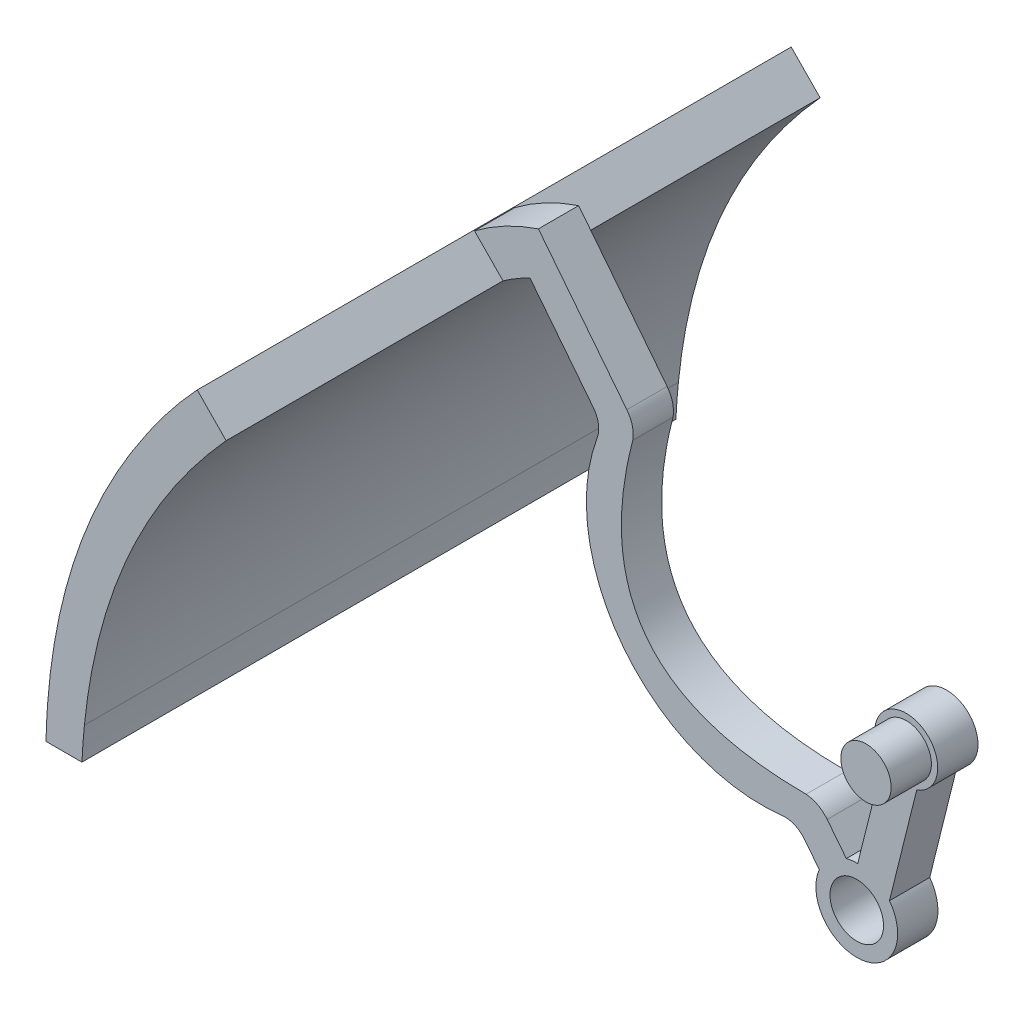
ISO-10303-21;
HEADER;
FILE_DESCRIPTION(('STEP AP214'),'2;1');
FILE_NAME('part.step','',(''),(''),'','','');
FILE_SCHEMA(('AUTOMOTIVE_DESIGN { 1 0 10303 214 1 1 1 1 }'));
ENDSEC;
DATA;
#1=APPLICATION_CONTEXT('core data for automotive mechanical design processes');
#2=APPLICATION_PROTOCOL_DEFINITION('international standard','automotive_design',2000,#1);
#3=PRODUCT_CONTEXT('',#1,'mechanical');
#4=PRODUCT('Part','Part','',(#3));
#5=PRODUCT_RELATED_PRODUCT_CATEGORY('part','',(#4));
#6=PRODUCT_DEFINITION_FORMATION('','',#4);
#7=PRODUCT_DEFINITION_CONTEXT('part definition',#1,'design');
#8=PRODUCT_DEFINITION('design','',#6,#7);
#9=PRODUCT_DEFINITION_SHAPE('','',#8);
#10=(LENGTH_UNIT() NAMED_UNIT(*) SI_UNIT(.MILLI.,.METRE.));
#11=(NAMED_UNIT(*) PLANE_ANGLE_UNIT() SI_UNIT($,.RADIAN.));
#12=(NAMED_UNIT(*) SI_UNIT($,.STERADIAN.) SOLID_ANGLE_UNIT());
#13=UNCERTAINTY_MEASURE_WITH_UNIT(LENGTH_MEASURE(1.E-05),#10,'distance_accuracy_value','');
#14=(GEOMETRIC_REPRESENTATION_CONTEXT(3) GLOBAL_UNCERTAINTY_ASSIGNED_CONTEXT((#13)) GLOBAL_UNIT_ASSIGNED_CONTEXT((#10,
#11,#12)) REPRESENTATION_CONTEXT('',''));
#15=CARTESIAN_POINT('',(0.,0.,0.));
#16=DIRECTION('',(0.,0.,1.));
#17=DIRECTION('',(1.,0.,0.));
#18=AXIS2_PLACEMENT_3D('',#15,#16,#17);
#19=CARTESIAN_POINT('',(19.2460995960396,21.529970793234,40.005));
#20=DIRECTION('',(0.,0.,-1.));
#21=DIRECTION('',(-1.,0.,0.));
#22=AXIS2_PLACEMENT_3D('',#19,#20,#21);
#23=CYLINDRICAL_SURFACE('',#22,23.4429883863396);
#24=DIRECTION('',(0.,0.,-1.));
#25=VECTOR('',#24,1.);
#26=CARTESIAN_POINT('',(9.08704396215267,42.6573770019867,40.005));
#27=LINE('',#26,#25);
#28=CARTESIAN_POINT('',(9.08704396215266,42.6573770019867,40.005));
#29=VERTEX_POINT('',#28);
#30=CARTESIAN_POINT('',(9.08704396215266,42.6573770019867,34.925));
#31=VERTEX_POINT('',#30);
#32=EDGE_CURVE('E286',#29,#31,#27,.T.);
#33=ORIENTED_EDGE('',*,*,#32,.F.);
#34=CARTESIAN_POINT('',(19.2460995960396,21.529970793234,40.005));
#35=DIRECTION('',(0.,0.,-1.));
#36=DIRECTION('',(-1.,0.,0.));
#37=AXIS2_PLACEMENT_3D('',#34,#35,#36);
#38=CIRCLE('',#37,23.4429883863396);
#39=CARTESIAN_POINT('',(5.67762300860634,40.6472443325839,40.005));
#40=VERTEX_POINT('',#39);
#41=EDGE_CURVE('E370',#40,#29,#38,.T.);
#42=ORIENTED_EDGE('',*,*,#41,.F.);
#43=DIRECTION('',(0.,0.,-1.));
#44=VECTOR('',#43,1.);
#45=CARTESIAN_POINT('',(5.67762300860634,40.6472443325839,40.005));
#46=LINE('',#45,#44);
#47=CARTESIAN_POINT('',(5.67762300860634,40.6472443325839,34.925));
#48=VERTEX_POINT('',#47);
#49=EDGE_CURVE('E374',#40,#48,#46,.T.);
#50=ORIENTED_EDGE('',*,*,#49,.T.);
#51=CARTESIAN_POINT('',(19.2460995960396,21.529970793234,34.925));
#52=DIRECTION('',(0.,0.,-1.));
#53=DIRECTION('',(-1.,0.,0.));
#54=AXIS2_PLACEMENT_3D('',#51,#52,#53);
#55=CIRCLE('',#54,23.4429883863396);
#56=EDGE_CURVE('E361',#48,#31,#55,.T.);
#57=ORIENTED_EDGE('',*,*,#56,.T.);
#58=EDGE_LOOP('',(#33,#42,#50,#57));
#59=FACE_BOUND('',#58,.T.);
#60=ADVANCED_FACE('F43',(#59),#23,.F.);
#61=CARTESIAN_POINT('',(2.03170084016378,44.3710469337757,74.93));
#62=DIRECTION('',(0.714539318399716,0.699595284761746,0.));
#63=DIRECTION('',(-0.699595284761746,0.714539318399716,0.));
#64=AXIS2_PLACEMENT_3D('',#61,#62,#63);
#65=PLANE('',#64);
#66=DIRECTION('',(0.,0.,-1.));
#67=VECTOR('',#66,1.);
#68=CARTESIAN_POINT('',(2.08714389423334,44.3144195623115,40.005));
#69=LINE('',#68,#67);
#70=CARTESIAN_POINT('',(2.08714389423334,44.3144195623115,40.005));
#71=VERTEX_POINT('',#70);
#72=CARTESIAN_POINT('',(2.08714389423334,44.3144195623115,34.925));
#73=VERTEX_POINT('',#72);
#74=EDGE_CURVE('E373',#71,#73,#69,.T.);
#75=ORIENTED_EDGE('',*,*,#74,.T.);
#76=DIRECTION('',(0.69959528476175,-0.714539318399712,0.));
#77=VECTOR('',#76,1.);
#78=CARTESIAN_POINT('',(23.2178871640164,22.7323031270756,34.925));
#79=LINE('',#78,#77);
#80=EDGE_CURVE('E355',#73,#48,#79,.T.);
#81=ORIENTED_EDGE('',*,*,#80,.T.);
#82=DIRECTION('',(0.,0.,-1.));
#83=VECTOR('',#82,1.);
#84=CARTESIAN_POINT('',(5.67762300860634,40.6472443325839,74.93));
#85=LINE('',#84,#83);
#86=CARTESIAN_POINT('',(5.67762300860634,40.6472443325839,0.));
#87=VERTEX_POINT('',#86);
#88=EDGE_CURVE('E583',#48,#87,#85,.T.);
#89=ORIENTED_EDGE('',*,*,#88,.T.);
#90=DIRECTION('',(0.699595284761746,-0.714539318399716,0.));
#91=VECTOR('',#90,1.);
#92=CARTESIAN_POINT('',(2.03170084016378,44.3710469337757,0.));
#93=LINE('',#92,#91);
#94=CARTESIAN_POINT('',(2.03170084016378,44.3710469337757,0.));
#95=VERTEX_POINT('',#94);
#96=EDGE_CURVE('E377',#95,#87,#93,.T.);
#97=ORIENTED_EDGE('',*,*,#96,.F.);
#98=DIRECTION('',(0.,0.,-1.));
#99=VECTOR('',#98,1.);
#100=CARTESIAN_POINT('',(2.03170084016378,44.3710469337757,74.93));
#101=LINE('',#100,#99);
#102=CARTESIAN_POINT('',(2.03170084016378,44.3710469337757,74.93));
#103=VERTEX_POINT('',#102);
#104=EDGE_CURVE('E391',#103,#95,#101,.T.);
#105=ORIENTED_EDGE('',*,*,#104,.F.);
#106=DIRECTION('',(0.699595284761746,-0.714539318399716,0.));
#107=VECTOR('',#106,1.);
#108=CARTESIAN_POINT('',(2.03170084016378,44.3710469337757,74.93));
#109=LINE('',#108,#107);
#110=CARTESIAN_POINT('',(5.67762300860634,40.6472443325839,74.93));
#111=VERTEX_POINT('',#110);
#112=EDGE_CURVE('E382',#103,#111,#109,.T.);
#113=ORIENTED_EDGE('',*,*,#112,.T.);
#114=EDGE_CURVE('E577',#111,#40,#85,.T.);
#115=ORIENTED_EDGE('',*,*,#114,.T.);
#116=DIRECTION('',(0.69959528476175,-0.714539318399712,0.));
#117=VECTOR('',#116,1.);
#118=CARTESIAN_POINT('',(23.2178871640164,22.7323031270756,40.005));
#119=LINE('',#118,#117);
#120=EDGE_CURVE('E364',#71,#40,#119,.T.);
#121=ORIENTED_EDGE('',*,*,#120,.F.);
#122=EDGE_LOOP('',(#75,#81,#89,#97,#105,#113,#115,#121));
#123=FACE_BOUND('',#122,.T.);
#124=ADVANCED_FACE('F45',(#123),#65,.T.);
#125=CARTESIAN_POINT('',(2.03170084016369,44.3710469337756,74.93));
#126=CARTESIAN_POINT('',(1.54506194315562,43.8493335032861,74.93));
#127=CARTESIAN_POINT('',(0.584048878796934,42.784657511292,74.93));
#128=CARTESIAN_POINT('',(-1.2278822813047,40.6342721712785,74.93));
#129=CARTESIAN_POINT('',(-4.20592041290579,36.7376412256842,74.93));
#130=CARTESIAN_POINT('',(-7.8686300715973,30.8427287351808,74.93));
#131=CARTESIAN_POINT('',(-11.2850757645936,23.2591606147364,74.93));
#132=CARTESIAN_POINT('',(-12.8911269544739,17.9284224113264,74.93));
#133=CARTESIAN_POINT('',(-13.5163822825003,15.2277853104537,74.93));
#134=B_SPLINE_CURVE_WITH_KNOTS('',3,(#125,#126,#127,#128,#129,#130,#131,#132,#133),
.UNSPECIFIED.,.F.,.F.,(4,1,1,1,1,1,4),(0.192222825960246,0.287167092833515,0.382111359706784,
0.571999893453322,0.951776960946398,1.33155402843947,1.71133109593255),.UNSPECIFIED.);
#135=DIRECTION('',(0.,0.,-1.));
#136=VECTOR('',#135,1.);
#137=SURFACE_OF_LINEAR_EXTRUSION('',#134,#136);
#138=CARTESIAN_POINT('',(2.03170084016369,44.3710469337756,0.));
#139=CARTESIAN_POINT('',(1.54506194315562,43.8493335032861,0.));
#140=CARTESIAN_POINT('',(0.584048878796934,42.784657511292,0.));
#141=CARTESIAN_POINT('',(-1.2278822813047,40.6342721712785,0.));
#142=CARTESIAN_POINT('',(-4.20592041290579,36.7376412256842,0.));
#143=CARTESIAN_POINT('',(-7.8686300715973,30.8427287351808,0.));
#144=CARTESIAN_POINT('',(-11.2850757645936,23.2591606147364,0.));
#145=CARTESIAN_POINT('',(-12.8911269544739,17.9284224113264,0.));
#146=CARTESIAN_POINT('',(-13.5163822825003,15.2277853104537,0.));
#147=B_SPLINE_CURVE_WITH_KNOTS('',3,(#138,#139,#140,#141,#142,#143,#144,#145,#146),
.UNSPECIFIED.,.F.,.F.,(4,1,1,1,1,1,4),(0.192222825960246,0.287167092833515,0.382111359706784,
0.571999893453322,0.951776960946398,1.33155402843947,1.71133109593255),.UNSPECIFIED.);
#148=CARTESIAN_POINT('',(-4.5365302116178,36.0596996946383,0.));
#149=VERTEX_POINT('',#148);
#150=EDGE_CURVE('E386',#95,#149,#147,.T.);
#151=ORIENTED_EDGE('',*,*,#150,.T.);
#152=DIRECTION('',(0.,0.,-1.));
#153=VECTOR('',#152,1.);
#154=CARTESIAN_POINT('',(-4.53653021854659,36.0596996842303,74.93));
#155=LINE('',#154,#153);
#156=CARTESIAN_POINT('',(-4.5365302116178,36.0596996946383,74.93));
#157=VERTEX_POINT('',#156);
#158=EDGE_CURVE('E66',#149,#157,#155,.F.);
#159=ORIENTED_EDGE('',*,*,#158,.T.);
#160=EDGE_CURVE('E385',#103,#157,#134,.T.);
#161=ORIENTED_EDGE('',*,*,#160,.F.);
#162=ORIENTED_EDGE('',*,*,#104,.T.);
#163=EDGE_LOOP('',(#151,#159,#161,#162));
#164=FACE_BOUND('',#163,.T.);
#165=ADVANCED_FACE('F396',(#164),#137,.F.);
#166=CARTESIAN_POINT('',(-11.6238657922747,7.6482492423895,74.93));
#167=DIRECTION('',(0.,0.,-1.));
#168=DIRECTION('',(-1.,0.,0.));
#169=AXIS2_PLACEMENT_3D('',#166,#167,#168);
#170=PLANE('',#169);
#171=CARTESIAN_POINT('',(5.67762300860634,40.6472443325839,74.93));
#172=CARTESIAN_POINT('',(-9.8790320964288,23.5215323798381,74.93));
#173=CARTESIAN_POINT('',(-12.1999935263348,0.628671186533673,74.93));
#174=B_SPLINE_CURVE_WITH_KNOTS('',2,(#171,#172,#173),.UNSPECIFIED.,.F.,.F.,(3,3),(0.,1.),.UNSPECIFIED.);
#175=CARTESIAN_POINT('',(-12.1999935263348,0.628671186533673,74.93));
#176=VERTEX_POINT('',#175);
#177=EDGE_CURVE('E325',#111,#176,#174,.T.);
#178=ORIENTED_EDGE('',*,*,#177,.F.);
#179=ORIENTED_EDGE('',*,*,#112,.F.);
#180=ORIENTED_EDGE('',*,*,#160,.T.);
#181=CARTESIAN_POINT('',(-16.8437433671853,0.628671186533673,74.93));
#182=CARTESIAN_POINT('',(-15.0089406588074,25.4945744171445,74.93));
#183=CARTESIAN_POINT('',(2.03170084016378,44.3710469337757,74.93));
#184=B_SPLINE_CURVE_WITH_KNOTS('',2,(#181,#182,#183),.UNSPECIFIED.,.F.,.F.,(3,3),(0.,1.),.UNSPECIFIED.);
#185=CARTESIAN_POINT('',(-16.8437433671853,0.628671186533673,74.93));
#186=VERTEX_POINT('',#185);
#187=EDGE_CURVE('E318',#186,#157,#184,.T.);
#188=ORIENTED_EDGE('',*,*,#187,.F.);
#189=CARTESIAN_POINT('',(926095.274424654,-377422.025325685,74.93));
#190=CARTESIAN_POINT('',(-930436.062649349,366506.821677623,74.93));
#191=CARTESIAN_POINT('',(934728.617374353,-355503.878612572,74.93));
#192=B_SPLINE_CURVE_WITH_KNOTS('',2,(#189,#190,#191),.UNSPECIFIED.,.F.,.F.,(3,3),(0.,1.),.UNSPECIFIED.);
#193=CARTESIAN_POINT('',(-17.0442105774959,-3.56902205301305,74.93));
#194=VERTEX_POINT('',#193);
#195=EDGE_CURVE('E288',#194,#186,#192,.T.);
#196=ORIENTED_EDGE('',*,*,#195,.F.);
#197=DIRECTION('',(1.,0.,0.));
#198=VECTOR('',#197,1.);
#199=CARTESIAN_POINT('',(0.,-3.56902205301305,74.93));
#200=LINE('',#199,#198);
#201=CARTESIAN_POINT('',(-12.5120122346454,-3.56902205301305,74.93));
#202=VERTEX_POINT('',#201);
#203=EDGE_CURVE('E549',#194,#202,#200,.T.);
#204=ORIENTED_EDGE('',*,*,#203,.T.);
#205=CARTESIAN_POINT('',(921353.978401041,-388858.069858918,74.93));
#206=CARTESIAN_POINT('',(-916760.002458557,399475.643906595,74.93));
#207=CARTESIAN_POINT('',(912138.756462011,-410007.141895332,74.93));
#208=B_SPLINE_CURVE_WITH_KNOTS('',2,(#205,#206,#207),.UNSPECIFIED.,.F.,.F.,(3,3),(0.,1.),.UNSPECIFIED.);
#209=EDGE_CURVE('E296',#176,#202,#208,.T.);
#210=ORIENTED_EDGE('',*,*,#209,.F.);
#211=EDGE_LOOP('',(#178,#179,#180,#188,#196,#204,#210));
#212=FACE_BOUND('',#211,.T.);
#213=ADVANCED_FACE('F399',(#212),#170,.F.);
#214=CARTESIAN_POINT('',(-11.6238657922747,7.6482492423895,0.));
#215=DIRECTION('',(0.,0.,-1.));
#216=DIRECTION('',(-1.,0.,0.));
#217=AXIS2_PLACEMENT_3D('',#214,#215,#216);
#218=PLANE('',#217);
#219=ORIENTED_EDGE('',*,*,#96,.T.);
#220=CARTESIAN_POINT('',(5.67762300860634,40.6472443325839,0.));
#221=CARTESIAN_POINT('',(-9.8790320964288,23.5215323798381,0.));
#222=CARTESIAN_POINT('',(-12.1999935263348,0.628671186533673,0.));
#223=B_SPLINE_CURVE_WITH_KNOTS('',2,(#220,#221,#222),.UNSPECIFIED.,.F.,.F.,(3,3),(0.,1.),.UNSPECIFIED.);
#224=CARTESIAN_POINT('',(-12.1999935263348,0.628671186533673,0.));
#225=VERTEX_POINT('',#224);
#226=EDGE_CURVE('E330',#87,#225,#223,.T.);
#227=ORIENTED_EDGE('',*,*,#226,.T.);
#228=CARTESIAN_POINT('',(921353.978401041,-388858.069858918,0.));
#229=CARTESIAN_POINT('',(-916760.002458557,399475.643906595,0.));
#230=CARTESIAN_POINT('',(912138.756462011,-410007.141895332,0.));
#231=B_SPLINE_CURVE_WITH_KNOTS('',2,(#228,#229,#230),.UNSPECIFIED.,.F.,.F.,(3,3),(0.,1.),.UNSPECIFIED.);
#232=CARTESIAN_POINT('',(-12.5120122346454,-3.56902205301305,0.));
#233=VERTEX_POINT('',#232);
#234=EDGE_CURVE('E536',#225,#233,#231,.T.);
#235=ORIENTED_EDGE('',*,*,#234,.T.);
#236=DIRECTION('',(1.,0.,0.));
#237=VECTOR('',#236,1.);
#238=CARTESIAN_POINT('',(0.,-3.56902205301305,0.));
#239=LINE('',#238,#237);
#240=CARTESIAN_POINT('',(-17.0442105774959,-3.56902205301305,0.));
#241=VERTEX_POINT('',#240);
#242=EDGE_CURVE('E295',#241,#233,#239,.T.);
#243=ORIENTED_EDGE('',*,*,#242,.F.);
#244=CARTESIAN_POINT('',(926095.274424654,-377422.025325685,0.));
#245=CARTESIAN_POINT('',(-930436.062649349,366506.821677623,0.));
#246=CARTESIAN_POINT('',(934728.617374353,-355503.878612572,0.));
#247=B_SPLINE_CURVE_WITH_KNOTS('',2,(#244,#245,#246),.UNSPECIFIED.,.F.,.F.,(3,3),(0.,1.),.UNSPECIFIED.);
#248=CARTESIAN_POINT('',(-16.8437433671853,0.628671186533673,0.));
#249=VERTEX_POINT('',#248);
#250=EDGE_CURVE('E289',#241,#249,#247,.T.);
#251=ORIENTED_EDGE('',*,*,#250,.T.);
#252=CARTESIAN_POINT('',(-16.8437433671853,0.628671186533673,0.));
#253=CARTESIAN_POINT('',(-15.0089406588074,25.4945744171445,0.));
#254=CARTESIAN_POINT('',(2.03170084016378,44.3710469337757,0.));
#255=B_SPLINE_CURVE_WITH_KNOTS('',2,(#252,#253,#254),.UNSPECIFIED.,.F.,.F.,(3,3),(0.,1.),.UNSPECIFIED.);
#256=EDGE_CURVE('E338',#249,#149,#255,.T.);
#257=ORIENTED_EDGE('',*,*,#256,.T.);
#258=ORIENTED_EDGE('',*,*,#150,.F.);
#259=EDGE_LOOP('',(#219,#227,#235,#243,#251,#257,#258));
#260=FACE_BOUND('',#259,.T.);
#261=ADVANCED_FACE('F400',(#260),#218,.T.);
#262=CARTESIAN_POINT('',(19.2460995960396,21.529970793234,40.005));
#263=DIRECTION('',(0.,0.,-1.));
#264=DIRECTION('',(-1.,0.,0.));
#265=AXIS2_PLACEMENT_3D('',#262,#263,#264);
#266=CYLINDRICAL_SURFACE('',#265,28.5229883863397);
#267=DIRECTION('',(0.,0.,-1.));
#268=VECTOR('',#267,1.);
#269=CARTESIAN_POINT('',(10.14487048346,48.5619610108928,40.005));
#270=LINE('',#269,#268);
#271=CARTESIAN_POINT('',(10.14487048346,48.5619610108928,40.005));
#272=VERTEX_POINT('',#271);
#273=CARTESIAN_POINT('',(10.14487048346,48.5619610108928,34.925));
#274=VERTEX_POINT('',#273);
#275=EDGE_CURVE('E378',#272,#274,#270,.T.);
#276=ORIENTED_EDGE('',*,*,#275,.T.);
#277=CARTESIAN_POINT('',(19.2460995960396,21.529970793234,34.925));
#278=DIRECTION('',(0.,0.,-1.));
#279=DIRECTION('',(-1.,0.,0.));
#280=AXIS2_PLACEMENT_3D('',#277,#278,#279);
#281=CIRCLE('',#280,28.5229883863397);
#282=EDGE_CURVE('E358',#73,#274,#281,.T.);
#283=ORIENTED_EDGE('',*,*,#282,.F.);
#284=ORIENTED_EDGE('',*,*,#74,.F.);
#285=CARTESIAN_POINT('',(19.2460995960396,21.529970793234,40.005));
#286=DIRECTION('',(0.,0.,-1.));
#287=DIRECTION('',(-1.,0.,0.));
#288=AXIS2_PLACEMENT_3D('',#285,#286,#287);
#289=CIRCLE('',#288,28.5229883863397);
#290=EDGE_CURVE('E367',#71,#272,#289,.T.);
#291=ORIENTED_EDGE('',*,*,#290,.T.);
#292=EDGE_LOOP('',(#276,#283,#284,#291));
#293=FACE_BOUND('',#292,.T.);
#294=ADVANCED_FACE('F403',(#293),#266,.T.);
#295=CARTESIAN_POINT('',(0.,0.,40.005));
#296=DIRECTION('',(0.,0.,-1.));
#297=DIRECTION('',(-1.,0.,0.));
#298=AXIS2_PLACEMENT_3D('',#295,#296,#297);
#299=PLANE('',#298);
#300=CARTESIAN_POINT('',(56.548749751771,14.8705258343598,40.005));
#301=DIRECTION('',(0.,0.,-1.));
#302=DIRECTION('',(-1.,0.,0.));
#303=AXIS2_PLACEMENT_3D('',#300,#301,#302);
#304=CIRCLE('',#303,3.175);
#305=CARTESIAN_POINT('',(53.373749751771,14.8705258343598,40.005));
#306=VERTEX_POINT('',#305);
#307=EDGE_CURVE('E11',#306,#306,#304,.F.);
#308=ORIENTED_EDGE('',*,*,#307,.F.);
#309=EDGE_LOOP('',(#308));
#310=FACE_BOUND('',#309,.T.);
#311=DIRECTION('',(-0.241183177051649,-0.970479610866335,0.));
#312=VECTOR('',#311,1.);
#313=CARTESIAN_POINT('',(51.8966841226826,-12.8973417009565,40.005));
#314=LINE('',#313,#312);
#315=CARTESIAN_POINT('',(57.866525974585,11.1242748487213,40.005));
#316=VERTEX_POINT('',#315);
#317=CARTESIAN_POINT('',(54.4314380854054,-2.69792783861099,40.005));
#318=VERTEX_POINT('',#317);
#319=EDGE_CURVE('E226',#316,#318,#314,.T.);
#320=ORIENTED_EDGE('',*,*,#319,.F.);
#321=CARTESIAN_POINT('',(56.548749751771,14.8705258343598,40.005));
#322=DIRECTION('',(0.,0.,1.));
#323=DIRECTION('',(1.,0.,0.));
#324=AXIS2_PLACEMENT_3D('',#321,#322,#323);
#325=CIRCLE('',#324,3.97126310143402);
#326=CARTESIAN_POINT('',(53.6271417480113,12.1807047821004,40.005));
#327=VERTEX_POINT('',#326);
#328=EDGE_CURVE('E58',#316,#327,#325,.T.);
#329=ORIENTED_EDGE('',*,*,#328,.T.);
#330=DIRECTION('',(-0.242416033277936,-0.970172390253295,0.));
#331=VECTOR('',#330,1.);
#332=CARTESIAN_POINT('',(47.6109909443717,-11.8965120849842,40.005));
#333=LINE('',#332,#331);
#334=CARTESIAN_POINT('',(50.4237652031478,-0.639517698185552,40.005));
#335=VERTEX_POINT('',#334);
#336=EDGE_CURVE('E223',#327,#335,#333,.T.);
#337=ORIENTED_EDGE('',*,*,#336,.T.);
#338=CARTESIAN_POINT('',(50.3069768115196,-5.79752609518428,40.005));
#339=DIRECTION('',(0.,0.,-1.));
#340=DIRECTION('',(-1.,0.,0.));
#341=AXIS2_PLACEMENT_3D('',#338,#339,#340);
#342=CIRCLE('',#341,5.15933039763175);
#343=CARTESIAN_POINT('',(48.9899815423943,-0.809118171504905,40.005));
#344=VERTEX_POINT('',#343);
#345=EDGE_CURVE('E233',#344,#335,#342,.T.);
#346=ORIENTED_EDGE('',*,*,#345,.F.);
#347=DIRECTION('',(0.618348453449566,-0.785904059104246,0.));
#348=VECTOR('',#347,1.);
#349=CARTESIAN_POINT('',(29.8652253259894,23.4979265958961,40.005));
#350=LINE('',#349,#348);
#351=CARTESIAN_POINT('',(46.5777423712602,2.25677217810078,40.005));
#352=VERTEX_POINT('',#351);
#353=EDGE_CURVE('E237',#352,#344,#350,.T.);
#354=ORIENTED_EDGE('',*,*,#353,.F.);
#355=CARTESIAN_POINT('',(43.6154814572686,-0.0739314665256757,40.005));
#356=DIRECTION('',(0.,0.,-1.));
#357=DIRECTION('',(-1.,0.,0.));
#358=AXIS2_PLACEMENT_3D('',#355,#356,#357);
#359=CIRCLE('',#358,3.76923987053595);
#360=CARTESIAN_POINT('',(43.9211751324713,3.68289173647163,40.005));
#361=VERTEX_POINT('',#360);
#362=EDGE_CURVE('E448',#352,#361,#359,.F.);
#363=ORIENTED_EDGE('',*,*,#362,.T.);
#364=CARTESIAN_POINT('',(43.9211751324713,3.68289173647172,40.005));
#365=CARTESIAN_POINT('',(14.804010115333,3.68541059728666,40.005));
#366=CARTESIAN_POINT('',(22.0524399907807,31.4093580334566,40.005));
#367=B_SPLINE_CURVE_WITH_KNOTS('',2,(#364,#365,#366),.UNSPECIFIED.,.F.,.F.,(3,3),(0.,1.),.UNSPECIFIED.);
#368=CARTESIAN_POINT('',(22.0524399907807,31.4093580334566,40.005));
#369=VERTEX_POINT('',#368);
#370=EDGE_CURVE('E443',#361,#369,#367,.T.);
#371=ORIENTED_EDGE('',*,*,#370,.T.);
#372=CARTESIAN_POINT('',(18.3384685656112,32.0524641325279,40.005));
#373=DIRECTION('',(0.,0.,-1.));
#374=DIRECTION('',(-1.,0.,0.));
#375=AXIS2_PLACEMENT_3D('',#372,#373,#374);
#376=CIRCLE('',#375,3.76923987053601);
#377=CARTESIAN_POINT('',(21.300729479603,34.3831677771542,40.005));
#378=VERTEX_POINT('',#377);
#379=EDGE_CURVE('E440',#378,#369,#376,.T.);
#380=ORIENTED_EDGE('',*,*,#379,.F.);
#381=DIRECTION('',(0.618348453449567,-0.785904059104245,0.));
#382=VECTOR('',#381,1.);
#383=CARTESIAN_POINT('',(29.8652253259894,23.4979265958961,40.005));
#384=LINE('',#383,#382);
#385=EDGE_CURVE('E438',#272,#378,#384,.T.);
#386=ORIENTED_EDGE('',*,*,#385,.F.);
#387=ORIENTED_EDGE('',*,*,#290,.F.);
#388=ORIENTED_EDGE('',*,*,#120,.T.);
#389=ORIENTED_EDGE('',*,*,#41,.T.);
#390=DIRECTION('',(-0.618348453449567,0.785904059104246,0.));
#391=VECTOR('',#390,1.);
#392=CARTESIAN_POINT('',(26.342457105335,20.7262164159211,40.005));
#393=LINE('',#392,#391);
#394=CARTESIAN_POINT('',(17.0779297979087,32.5011785363403,40.005));
#395=VERTEX_POINT('',#394);
#396=EDGE_CURVE('E216',#395,#29,#393,.T.);
#397=ORIENTED_EDGE('',*,*,#396,.F.);
#398=CARTESIAN_POINT('',(14.5826844102528,30.537922196638,40.005));
#399=DIRECTION('',(0.,0.,-1.));
#400=DIRECTION('',(-1.,0.,0.));
#401=AXIS2_PLACEMENT_3D('',#398,#399,#400);
#402=CIRCLE('',#401,3.17499999999998);
#403=CARTESIAN_POINT('',(17.5615469750968,29.4392853959752,40.005));
#404=VERTEX_POINT('',#403);
#405=EDGE_CURVE('E251',#404,#395,#402,.F.);
#406=ORIENTED_EDGE('',*,*,#405,.F.);
#407=CARTESIAN_POINT('',(38.2910268676441,21.7940285327257,40.005));
#408=DIRECTION('',(0.,0.,-1.));
#409=DIRECTION('',(-1.,0.,0.));
#410=AXIS2_PLACEMENT_3D('',#407,#408,#409);
#411=CIRCLE('',#410,22.0943723404985);
#412=CARTESIAN_POINT('',(40.8441968483972,-0.152329073263683,40.005));
#413=VERTEX_POINT('',#412);
#414=EDGE_CURVE('E248',#404,#413,#411,.F.);
#415=ORIENTED_EDGE('',*,*,#414,.T.);
#416=CARTESIAN_POINT('',(41.2110918460901,-3.30605909669112,40.005));
#417=DIRECTION('',(0.,0.,-1.));
#418=DIRECTION('',(-1.,0.,0.));
#419=AXIS2_PLACEMENT_3D('',#416,#417,#418);
#420=CIRCLE('',#419,3.17499999999989);
#421=CARTESIAN_POINT('',(43.706337233746,-1.34280275698884,40.005));
#422=VERTEX_POINT('',#421);
#423=EDGE_CURVE('E245',#413,#422,#420,.T.);
#424=ORIENTED_EDGE('',*,*,#423,.T.);
#425=DIRECTION('',(-0.618348453449567,0.785904059104245,0.));
#426=VECTOR('',#425,1.);
#427=CARTESIAN_POINT('',(26.342457105335,20.7262164159211,40.005));
#428=LINE('',#427,#426);
#429=CARTESIAN_POINT('',(45.5816573055706,-3.7262835409136,40.005));
#430=VERTEX_POINT('',#429);
#431=EDGE_CURVE('E242',#430,#422,#428,.T.);
#432=ORIENTED_EDGE('',*,*,#431,.F.);
#433=CARTESIAN_POINT('',(50.3069768115196,-5.79752609518428,40.005));
#434=DIRECTION('',(0.,0.,-1.));
#435=DIRECTION('',(-1.,0.,0.));
#436=AXIS2_PLACEMENT_3D('',#433,#434,#435);
#437=CIRCLE('',#436,5.15933039763203);
#438=EDGE_CURVE('E235',#318,#430,#437,.T.);
#439=ORIENTED_EDGE('',*,*,#438,.F.);
#440=EDGE_LOOP('',(#320,#329,#337,#346,#354,#363,#371,#380,#386,#387,#388,#389,#397,#406,#415,
#424,#432,#439));
#441=FACE_BOUND('',#440,.T.);
#442=CARTESIAN_POINT('',(50.3069768115196,-5.79752609518428,40.005));
#443=DIRECTION('',(0.,0.,-1.));
#444=DIRECTION('',(-1.,0.,0.));
#445=AXIS2_PLACEMENT_3D('',#442,#443,#444);
#446=CIRCLE('',#445,3.3782);
#447=CARTESIAN_POINT('',(46.9287768115196,-5.79752609518428,40.005));
#448=VERTEX_POINT('',#447);
#449=EDGE_CURVE('E253',#448,#448,#446,.T.);
#450=ORIENTED_EDGE('',*,*,#449,.T.);
#451=EDGE_LOOP('',(#450));
#452=FACE_BOUND('',#451,.T.);
#453=ADVANCED_FACE('F220',(#310,#441,#452),#299,.F.);
#454=CARTESIAN_POINT('',(0.,0.,34.925));
#455=DIRECTION('',(0.,0.,-1.));
#456=DIRECTION('',(-1.,0.,0.));
#457=AXIS2_PLACEMENT_3D('',#454,#455,#456);
#458=PLANE('',#457);
#459=DIRECTION('',(-0.242416033277936,-0.970172390253295,0.));
#460=VECTOR('',#459,1.);
#461=CARTESIAN_POINT('',(47.6109909443717,-11.8965120849842,34.925));
#462=LINE('',#461,#460);
#463=CARTESIAN_POINT('',(53.6271417480113,12.1807047821004,34.925));
#464=VERTEX_POINT('',#463);
#465=CARTESIAN_POINT('',(50.4237652031478,-0.639517698185552,34.925));
#466=VERTEX_POINT('',#465);
#467=EDGE_CURVE('E427',#464,#466,#462,.T.);
#468=ORIENTED_EDGE('',*,*,#467,.F.);
#469=CARTESIAN_POINT('',(56.548749751771,14.8705258343598,34.925));
#470=DIRECTION('',(0.,0.,-1.));
#471=DIRECTION('',(-1.,0.,0.));
#472=AXIS2_PLACEMENT_3D('',#469,#470,#471);
#473=CIRCLE('',#472,3.97126310143402);
#474=CARTESIAN_POINT('',(57.866525974585,11.1242748487213,34.925));
#475=VERTEX_POINT('',#474);
#476=EDGE_CURVE('E212',#475,#464,#473,.F.);
#477=ORIENTED_EDGE('',*,*,#476,.F.);
#478=DIRECTION('',(-0.241183177051649,-0.970479610866335,0.));
#479=VECTOR('',#478,1.);
#480=CARTESIAN_POINT('',(51.8966841226826,-12.8973417009565,34.925));
#481=LINE('',#480,#479);
#482=CARTESIAN_POINT('',(54.4314380854054,-2.69792783861099,34.925));
#483=VERTEX_POINT('',#482);
#484=EDGE_CURVE('E465',#475,#483,#481,.T.);
#485=ORIENTED_EDGE('',*,*,#484,.T.);
#486=CARTESIAN_POINT('',(50.3069768115196,-5.79752609518428,34.925));
#487=DIRECTION('',(0.,0.,-1.));
#488=DIRECTION('',(-1.,0.,0.));
#489=AXIS2_PLACEMENT_3D('',#486,#487,#488);
#490=CIRCLE('',#489,5.15933039763203);
#491=CARTESIAN_POINT('',(45.5816573055706,-3.7262835409136,34.925));
#492=VERTEX_POINT('',#491);
#493=EDGE_CURVE('E472',#483,#492,#490,.T.);
#494=ORIENTED_EDGE('',*,*,#493,.T.);
#495=DIRECTION('',(-0.618348453449567,0.785904059104245,0.));
#496=VECTOR('',#495,1.);
#497=CARTESIAN_POINT('',(26.342457105335,20.7262164159211,34.925));
#498=LINE('',#497,#496);
#499=CARTESIAN_POINT('',(43.706337233746,-1.34280275698884,34.925));
#500=VERTEX_POINT('',#499);
#501=EDGE_CURVE('E474',#492,#500,#498,.T.);
#502=ORIENTED_EDGE('',*,*,#501,.T.);
#503=CARTESIAN_POINT('',(41.2110918460901,-3.30605909669112,34.925));
#504=DIRECTION('',(0.,0.,-1.));
#505=DIRECTION('',(-1.,0.,0.));
#506=AXIS2_PLACEMENT_3D('',#503,#504,#505);
#507=CIRCLE('',#506,3.17499999999989);
#508=CARTESIAN_POINT('',(40.8441968483972,-0.152329073263683,34.925));
#509=VERTEX_POINT('',#508);
#510=EDGE_CURVE('E476',#509,#500,#507,.T.);
#511=ORIENTED_EDGE('',*,*,#510,.F.);
#512=CARTESIAN_POINT('',(38.2910268676441,21.7940285327257,34.925));
#513=DIRECTION('',(0.,0.,-1.));
#514=DIRECTION('',(-1.,0.,0.));
#515=AXIS2_PLACEMENT_3D('',#512,#513,#514);
#516=CIRCLE('',#515,22.0943723404985);
#517=CARTESIAN_POINT('',(17.5615469750968,29.4392853959752,34.925));
#518=VERTEX_POINT('',#517);
#519=EDGE_CURVE('E433',#518,#509,#516,.F.);
#520=ORIENTED_EDGE('',*,*,#519,.F.);
#521=CARTESIAN_POINT('',(14.5826844102528,30.537922196638,34.925));
#522=DIRECTION('',(0.,0.,-1.));
#523=DIRECTION('',(-1.,0.,0.));
#524=AXIS2_PLACEMENT_3D('',#521,#522,#523);
#525=CIRCLE('',#524,3.17499999999998);
#526=CARTESIAN_POINT('',(17.0779297979087,32.5011785363403,34.925));
#527=VERTEX_POINT('',#526);
#528=EDGE_CURVE('E431',#518,#527,#525,.F.);
#529=ORIENTED_EDGE('',*,*,#528,.T.);
#530=DIRECTION('',(-0.618348453449567,0.785904059104246,0.));
#531=VECTOR('',#530,1.);
#532=CARTESIAN_POINT('',(26.342457105335,20.7262164159211,34.925));
#533=LINE('',#532,#531);
#534=EDGE_CURVE('E256',#527,#31,#533,.T.);
#535=ORIENTED_EDGE('',*,*,#534,.T.);
#536=ORIENTED_EDGE('',*,*,#56,.F.);
#537=ORIENTED_EDGE('',*,*,#80,.F.);
#538=ORIENTED_EDGE('',*,*,#282,.T.);
#539=DIRECTION('',(0.618348453449567,-0.785904059104245,0.));
#540=VECTOR('',#539,1.);
#541=CARTESIAN_POINT('',(29.8652253259894,23.4979265958961,34.925));
#542=LINE('',#541,#540);
#543=CARTESIAN_POINT('',(21.300729479603,34.3831677771542,34.925));
#544=VERTEX_POINT('',#543);
#545=EDGE_CURVE('E502',#274,#544,#542,.T.);
#546=ORIENTED_EDGE('',*,*,#545,.T.);
#547=CARTESIAN_POINT('',(18.3384685656112,32.0524641325279,34.925));
#548=DIRECTION('',(0.,0.,-1.));
#549=DIRECTION('',(-1.,0.,0.));
#550=AXIS2_PLACEMENT_3D('',#547,#548,#549);
#551=CIRCLE('',#550,3.76923987053601);
#552=CARTESIAN_POINT('',(22.0524399907807,31.4093580334566,34.925));
#553=VERTEX_POINT('',#552);
#554=EDGE_CURVE('E504',#544,#553,#551,.T.);
#555=ORIENTED_EDGE('',*,*,#554,.T.);
#556=CARTESIAN_POINT('',(43.9211751324713,3.68289173647172,34.925));
#557=CARTESIAN_POINT('',(14.804010115333,3.68541059728666,34.925));
#558=CARTESIAN_POINT('',(22.0524399907807,31.4093580334566,34.925));
#559=B_SPLINE_CURVE_WITH_KNOTS('',2,(#556,#557,#558),.UNSPECIFIED.,.F.,.F.,(3,3),(0.,1.),.UNSPECIFIED.);
#560=CARTESIAN_POINT('',(43.9211751324713,3.68289173647163,34.925));
#561=VERTEX_POINT('',#560);
#562=EDGE_CURVE('E509',#561,#553,#559,.T.);
#563=ORIENTED_EDGE('',*,*,#562,.F.);
#564=CARTESIAN_POINT('',(43.6154814572686,-0.0739314665256757,34.925));
#565=DIRECTION('',(0.,0.,-1.));
#566=DIRECTION('',(-1.,0.,0.));
#567=AXIS2_PLACEMENT_3D('',#564,#565,#566);
#568=CIRCLE('',#567,3.76923987053595);
#569=CARTESIAN_POINT('',(46.5777423712602,2.25677217810078,34.925));
#570=VERTEX_POINT('',#569);
#571=EDGE_CURVE('E467',#570,#561,#568,.F.);
#572=ORIENTED_EDGE('',*,*,#571,.F.);
#573=DIRECTION('',(0.618348453449566,-0.785904059104246,0.));
#574=VECTOR('',#573,1.);
#575=CARTESIAN_POINT('',(29.8652253259894,23.4979265958961,34.925));
#576=LINE('',#575,#574);
#577=CARTESIAN_POINT('',(48.9899815423943,-0.809118171504905,34.925));
#578=VERTEX_POINT('',#577);
#579=EDGE_CURVE('E463',#570,#578,#576,.T.);
#580=ORIENTED_EDGE('',*,*,#579,.T.);
#581=CARTESIAN_POINT('',(50.3069768115196,-5.79752609518428,34.925));
#582=DIRECTION('',(0.,0.,-1.));
#583=DIRECTION('',(-1.,0.,0.));
#584=AXIS2_PLACEMENT_3D('',#581,#582,#583);
#585=CIRCLE('',#584,5.15933039763175);
#586=EDGE_CURVE('E462',#578,#466,#585,.T.);
#587=ORIENTED_EDGE('',*,*,#586,.T.);
#588=EDGE_LOOP('',(#468,#477,#485,#494,#502,#511,#520,#529,#535,#536,#537,#538,#546,#555,#563,
#572,#580,#587));
#589=FACE_BOUND('',#588,.T.);
#590=CARTESIAN_POINT('',(50.3069768115196,-5.79752609518428,34.925));
#591=DIRECTION('',(0.,0.,-1.));
#592=DIRECTION('',(-1.,0.,0.));
#593=AXIS2_PLACEMENT_3D('',#590,#591,#592);
#594=CIRCLE('',#593,3.3782);
#595=CARTESIAN_POINT('',(46.9287768115196,-5.79752609518428,34.925));
#596=VERTEX_POINT('',#595);
#597=EDGE_CURVE('E261',#596,#596,#594,.T.);
#598=ORIENTED_EDGE('',*,*,#597,.F.);
#599=EDGE_LOOP('',(#598));
#600=FACE_BOUND('',#599,.T.);
#601=ADVANCED_FACE('F415',(#589,#600),#458,.T.);
#602=DIRECTION('',(0.,0.,-1.));
#603=VECTOR('',#602,1.);
#604=SURFACE_OF_LINEAR_EXTRUSION('',#174,#603);
#605=ORIENTED_EDGE('',*,*,#226,.F.);
#606=ORIENTED_EDGE('',*,*,#88,.F.);
#607=ORIENTED_EDGE('',*,*,#49,.F.);
#608=ORIENTED_EDGE('',*,*,#114,.F.);
#609=ORIENTED_EDGE('',*,*,#177,.T.);
#610=DIRECTION('',(0.,0.,-1.));
#611=VECTOR('',#610,1.);
#612=CARTESIAN_POINT('',(-12.1999935263348,0.628671186533673,74.93));
#613=LINE('',#612,#611);
#614=EDGE_CURVE('E324',#176,#225,#613,.T.);
#615=ORIENTED_EDGE('',*,*,#614,.T.);
#616=EDGE_LOOP('',(#605,#606,#607,#608,#609,#615));
#617=FACE_BOUND('',#616,.T.);
#618=ADVANCED_FACE('F314',(#617),#604,.T.);
#619=DIRECTION('',(0.,0.,-1.));
#620=VECTOR('',#619,1.);
#621=SURFACE_OF_LINEAR_EXTRUSION('',#184,#620);
#622=ORIENTED_EDGE('',*,*,#158,.F.);
#623=ORIENTED_EDGE('',*,*,#256,.F.);
#624=DIRECTION('',(0.,0.,-1.));
#625=VECTOR('',#624,1.);
#626=CARTESIAN_POINT('',(-16.8437433671853,0.628671186533673,74.93));
#627=LINE('',#626,#625);
#628=EDGE_CURVE('E347',#186,#249,#627,.T.);
#629=ORIENTED_EDGE('',*,*,#628,.F.);
#630=ORIENTED_EDGE('',*,*,#187,.T.);
#631=EDGE_LOOP('',(#622,#623,#629,#630));
#632=FACE_BOUND('',#631,.T.);
#633=ADVANCED_FACE('F307',(#632),#621,.T.);
#634=DIRECTION('',(0.,0.,1.));
#635=VECTOR('',#634,1.);
#636=SURFACE_OF_LINEAR_EXTRUSION('',#247,#635);
#637=ORIENTED_EDGE('',*,*,#195,.T.);
#638=ORIENTED_EDGE('',*,*,#628,.T.);
#639=ORIENTED_EDGE('',*,*,#250,.F.);
#640=DIRECTION('',(0.,0.,1.));
#641=VECTOR('',#640,1.);
#642=CARTESIAN_POINT('',(-17.0442105774959,-3.56902205301305,0.));
#643=LINE('',#642,#641);
#644=EDGE_CURVE('E541',#241,#194,#643,.T.);
#645=ORIENTED_EDGE('',*,*,#644,.T.);
#646=EDGE_LOOP('',(#637,#638,#639,#645));
#647=FACE_BOUND('',#646,.T.);
#648=ADVANCED_FACE('F302',(#647),#636,.F.);
#649=DIRECTION('',(0.,0.,1.));
#650=VECTOR('',#649,1.);
#651=SURFACE_OF_LINEAR_EXTRUSION('',#231,#650);
#652=ORIENTED_EDGE('',*,*,#209,.T.);
#653=DIRECTION('',(0.,0.,1.));
#654=VECTOR('',#653,1.);
#655=CARTESIAN_POINT('',(-12.5120122346454,-3.56902205301305,0.));
#656=LINE('',#655,#654);
#657=EDGE_CURVE('E339',#233,#202,#656,.T.);
#658=ORIENTED_EDGE('',*,*,#657,.F.);
#659=ORIENTED_EDGE('',*,*,#234,.F.);
#660=ORIENTED_EDGE('',*,*,#614,.F.);
#661=EDGE_LOOP('',(#652,#658,#659,#660));
#662=FACE_BOUND('',#661,.T.);
#663=ADVANCED_FACE('F306',(#662),#651,.F.);
#664=CARTESIAN_POINT('',(0.,-3.56902205301305,0.));
#665=DIRECTION('',(0.,-1.,0.));
#666=DIRECTION('',(0.,0.,-1.));
#667=AXIS2_PLACEMENT_3D('',#664,#665,#666);
#668=PLANE('',#667);
#669=ORIENTED_EDGE('',*,*,#203,.F.);
#670=ORIENTED_EDGE('',*,*,#644,.F.);
#671=ORIENTED_EDGE('',*,*,#242,.T.);
#672=ORIENTED_EDGE('',*,*,#657,.T.);
#673=EDGE_LOOP('',(#669,#670,#671,#672));
#674=FACE_BOUND('',#673,.T.);
#675=ADVANCED_FACE('F309',(#674),#668,.T.);
#676=CARTESIAN_POINT('',(26.342457105335,20.7262164159211,34.925));
#677=DIRECTION('',(0.785904059104245,0.618348453449567,0.));
#678=DIRECTION('',(-0.618348453449567,0.785904059104245,0.));
#679=AXIS2_PLACEMENT_3D('',#676,#677,#678);
#680=PLANE('',#679);
#681=ORIENTED_EDGE('',*,*,#396,.T.);
#682=ORIENTED_EDGE('',*,*,#32,.T.);
#683=ORIENTED_EDGE('',*,*,#534,.F.);
#684=DIRECTION('',(0.,0.,1.));
#685=VECTOR('',#684,1.);
#686=CARTESIAN_POINT('',(17.0779297979087,32.5011785363403,34.925));
#687=LINE('',#686,#685);
#688=EDGE_CURVE('E257',#527,#395,#687,.T.);
#689=ORIENTED_EDGE('',*,*,#688,.T.);
#690=EDGE_LOOP('',(#681,#682,#683,#689));
#691=FACE_BOUND('',#690,.T.);
#692=ADVANCED_FACE('F499',(#691),#680,.F.);
#693=CARTESIAN_POINT('',(29.8652253259894,23.4979265958961,34.925));
#694=DIRECTION('',(-0.785904059104245,-0.618348453449567,0.));
#695=DIRECTION('',(0.618348453449567,-0.785904059104245,0.));
#696=AXIS2_PLACEMENT_3D('',#693,#694,#695);
#697=PLANE('',#696);
#698=ORIENTED_EDGE('',*,*,#385,.T.);
#699=DIRECTION('',(0.,0.,1.));
#700=VECTOR('',#699,1.);
#701=CARTESIAN_POINT('',(21.300729479603,34.3831677771542,34.925));
#702=LINE('',#701,#700);
#703=EDGE_CURVE('E283',#544,#378,#702,.T.);
#704=ORIENTED_EDGE('',*,*,#703,.F.);
#705=ORIENTED_EDGE('',*,*,#545,.F.);
#706=ORIENTED_EDGE('',*,*,#275,.F.);
#707=EDGE_LOOP('',(#698,#704,#705,#706));
#708=FACE_BOUND('',#707,.T.);
#709=ADVANCED_FACE('F528',(#708),#697,.F.);
#710=CARTESIAN_POINT('',(18.3384685656112,32.0524641325279,34.925));
#711=DIRECTION('',(0.,0.,1.));
#712=DIRECTION('',(1.,0.,0.));
#713=AXIS2_PLACEMENT_3D('',#710,#711,#712);
#714=CYLINDRICAL_SURFACE('',#713,3.76923987053601);
#715=ORIENTED_EDGE('',*,*,#379,.T.);
#716=DIRECTION('',(0.,0.,1.));
#717=VECTOR('',#716,1.);
#718=CARTESIAN_POINT('',(22.0524399907807,31.4093580334566,34.925));
#719=LINE('',#718,#717);
#720=EDGE_CURVE('E281',#553,#369,#719,.T.);
#721=ORIENTED_EDGE('',*,*,#720,.F.);
#722=ORIENTED_EDGE('',*,*,#554,.F.);
#723=ORIENTED_EDGE('',*,*,#703,.T.);
#724=EDGE_LOOP('',(#715,#721,#722,#723));
#725=FACE_BOUND('',#724,.T.);
#726=ADVANCED_FACE('F523',(#725),#714,.T.);
#727=DIRECTION('',(0.,0.,1.));
#728=VECTOR('',#727,1.);
#729=SURFACE_OF_LINEAR_EXTRUSION('',#559,#728);
#730=ORIENTED_EDGE('',*,*,#370,.F.);
#731=DIRECTION('',(0.,0.,1.));
#732=VECTOR('',#731,1.);
#733=CARTESIAN_POINT('',(43.9211751324713,3.68289173647163,34.925));
#734=LINE('',#733,#732);
#735=EDGE_CURVE('E279',#561,#361,#734,.T.);
#736=ORIENTED_EDGE('',*,*,#735,.F.);
#737=ORIENTED_EDGE('',*,*,#562,.T.);
#738=ORIENTED_EDGE('',*,*,#720,.T.);
#739=EDGE_LOOP('',(#730,#736,#737,#738));
#740=FACE_BOUND('',#739,.T.);
#741=ADVANCED_FACE('F518',(#740),#729,.T.);
#742=CARTESIAN_POINT('',(43.6154814572686,-0.0739314665256757,34.925));
#743=DIRECTION('',(0.,0.,1.));
#744=DIRECTION('',(1.,0.,0.));
#745=AXIS2_PLACEMENT_3D('',#742,#743,#744);
#746=CYLINDRICAL_SURFACE('',#745,3.76923987053595);
#747=ORIENTED_EDGE('',*,*,#362,.F.);
#748=DIRECTION('',(0.,0.,1.));
#749=VECTOR('',#748,1.);
#750=CARTESIAN_POINT('',(46.5777423712602,2.25677217810078,34.925));
#751=LINE('',#750,#749);
#752=EDGE_CURVE('E277',#570,#352,#751,.T.);
#753=ORIENTED_EDGE('',*,*,#752,.F.);
#754=ORIENTED_EDGE('',*,*,#571,.T.);
#755=ORIENTED_EDGE('',*,*,#735,.T.);
#756=EDGE_LOOP('',(#747,#753,#754,#755));
#757=FACE_BOUND('',#756,.T.);
#758=ADVANCED_FACE('F522',(#757),#746,.T.);
#759=CARTESIAN_POINT('',(29.8652253259894,23.4979265958961,34.925));
#760=DIRECTION('',(-0.785904059104246,-0.618348453449566,0.));
#761=DIRECTION('',(0.618348453449566,-0.785904059104246,0.));
#762=AXIS2_PLACEMENT_3D('',#759,#760,#761);
#763=PLANE('',#762);
#764=ORIENTED_EDGE('',*,*,#353,.T.);
#765=DIRECTION('',(0.,0.,1.));
#766=VECTOR('',#765,1.);
#767=CARTESIAN_POINT('',(48.9899815423943,-0.809118171504905,34.925));
#768=LINE('',#767,#766);
#769=EDGE_CURVE('E274',#578,#344,#768,.T.);
#770=ORIENTED_EDGE('',*,*,#769,.F.);
#771=ORIENTED_EDGE('',*,*,#579,.F.);
#772=ORIENTED_EDGE('',*,*,#752,.T.);
#773=EDGE_LOOP('',(#764,#770,#771,#772));
#774=FACE_BOUND('',#773,.T.);
#775=ADVANCED_FACE('F456',(#774),#763,.F.);
#776=CARTESIAN_POINT('',(50.3069768115196,-5.79752609518428,34.925));
#777=DIRECTION('',(0.,0.,1.));
#778=DIRECTION('',(1.,0.,0.));
#779=AXIS2_PLACEMENT_3D('',#776,#777,#778);
#780=CYLINDRICAL_SURFACE('',#779,5.15933039763175);
#781=ORIENTED_EDGE('',*,*,#345,.T.);
#782=DIRECTION('',(0.,0.,1.));
#783=VECTOR('',#782,1.);
#784=CARTESIAN_POINT('',(50.4237652031478,-0.639517698185552,34.925));
#785=LINE('',#784,#783);
#786=EDGE_CURVE('E231',#466,#335,#785,.T.);
#787=ORIENTED_EDGE('',*,*,#786,.F.);
#788=ORIENTED_EDGE('',*,*,#586,.F.);
#789=ORIENTED_EDGE('',*,*,#769,.T.);
#790=EDGE_LOOP('',(#781,#787,#788,#789));
#791=FACE_BOUND('',#790,.T.);
#792=ADVANCED_FACE('F461',(#791),#780,.T.);
#793=CARTESIAN_POINT('',(47.6109909443717,-11.8965120849842,34.925));
#794=DIRECTION('',(-0.970172390253295,0.242416033277936,0.));
#795=DIRECTION('',(-0.242416033277936,-0.970172390253295,0.));
#796=AXIS2_PLACEMENT_3D('',#793,#794,#795);
#797=PLANE('',#796);
#798=DIRECTION('',(0.,0.,1.));
#799=VECTOR('',#798,1.);
#800=CARTESIAN_POINT('',(53.6271417480113,12.1807047821004,23.6925717244003));
#801=LINE('',#800,#799);
#802=EDGE_CURVE('E209',#464,#327,#801,.T.);
#803=ORIENTED_EDGE('',*,*,#802,.F.);
#804=ORIENTED_EDGE('',*,*,#467,.T.);
#805=ORIENTED_EDGE('',*,*,#786,.T.);
#806=ORIENTED_EDGE('',*,*,#336,.F.);
#807=EDGE_LOOP('',(#803,#804,#805,#806));
#808=FACE_BOUND('',#807,.T.);
#809=ADVANCED_FACE('F229',(#808),#797,.T.);
#810=CARTESIAN_POINT('',(51.8966841226826,-12.8973417009565,34.925));
#811=DIRECTION('',(-0.970479610866335,0.241183177051649,0.));
#812=DIRECTION('',(-0.241183177051649,-0.970479610866335,0.));
#813=AXIS2_PLACEMENT_3D('',#810,#811,#812);
#814=PLANE('',#813);
#815=ORIENTED_EDGE('',*,*,#484,.F.);
#816=DIRECTION('',(0.,0.,1.));
#817=VECTOR('',#816,1.);
#818=CARTESIAN_POINT('',(57.866525974585,11.1242748487213,23.6925717244003));
#819=LINE('',#818,#817);
#820=EDGE_CURVE('E51',#475,#316,#819,.T.);
#821=ORIENTED_EDGE('',*,*,#820,.T.);
#822=ORIENTED_EDGE('',*,*,#319,.T.);
#823=DIRECTION('',(0.,0.,1.));
#824=VECTOR('',#823,1.);
#825=CARTESIAN_POINT('',(54.4314380854054,-2.69792783861099,34.925));
#826=LINE('',#825,#824);
#827=EDGE_CURVE('E270',#483,#318,#826,.T.);
#828=ORIENTED_EDGE('',*,*,#827,.F.);
#829=EDGE_LOOP('',(#815,#821,#822,#828));
#830=FACE_BOUND('',#829,.T.);
#831=ADVANCED_FACE('F589',(#830),#814,.F.);
#832=CARTESIAN_POINT('',(50.3069768115196,-5.79752609518428,34.925));
#833=DIRECTION('',(0.,0.,1.));
#834=DIRECTION('',(1.,0.,0.));
#835=AXIS2_PLACEMENT_3D('',#832,#833,#834);
#836=CYLINDRICAL_SURFACE('',#835,5.15933039763203);
#837=ORIENTED_EDGE('',*,*,#438,.T.);
#838=DIRECTION('',(0.,0.,1.));
#839=VECTOR('',#838,1.);
#840=CARTESIAN_POINT('',(45.5816573055706,-3.7262835409136,34.925));
#841=LINE('',#840,#839);
#842=EDGE_CURVE('E267',#492,#430,#841,.T.);
#843=ORIENTED_EDGE('',*,*,#842,.F.);
#844=ORIENTED_EDGE('',*,*,#493,.F.);
#845=ORIENTED_EDGE('',*,*,#827,.T.);
#846=EDGE_LOOP('',(#837,#843,#844,#845));
#847=FACE_BOUND('',#846,.T.);
#848=ADVANCED_FACE('F620',(#847),#836,.T.);
#849=CARTESIAN_POINT('',(26.342457105335,20.7262164159211,34.925));
#850=DIRECTION('',(0.785904059104245,0.618348453449567,0.));
#851=DIRECTION('',(-0.618348453449567,0.785904059104245,0.));
#852=AXIS2_PLACEMENT_3D('',#849,#850,#851);
#853=PLANE('',#852);
#854=ORIENTED_EDGE('',*,*,#431,.T.);
#855=DIRECTION('',(0.,0.,1.));
#856=VECTOR('',#855,1.);
#857=CARTESIAN_POINT('',(43.706337233746,-1.34280275698884,34.925));
#858=LINE('',#857,#856);
#859=EDGE_CURVE('E265',#500,#422,#858,.T.);
#860=ORIENTED_EDGE('',*,*,#859,.F.);
#861=ORIENTED_EDGE('',*,*,#501,.F.);
#862=ORIENTED_EDGE('',*,*,#842,.T.);
#863=EDGE_LOOP('',(#854,#860,#861,#862));
#864=FACE_BOUND('',#863,.T.);
#865=ADVANCED_FACE('F617',(#864),#853,.F.);
#866=CARTESIAN_POINT('',(41.2110918460901,-3.30605909669112,34.925));
#867=DIRECTION('',(0.,0.,1.));
#868=DIRECTION('',(1.,0.,0.));
#869=AXIS2_PLACEMENT_3D('',#866,#867,#868);
#870=CYLINDRICAL_SURFACE('',#869,3.17499999999989);
#871=ORIENTED_EDGE('',*,*,#423,.F.);
#872=DIRECTION('',(0.,0.,1.));
#873=VECTOR('',#872,1.);
#874=CARTESIAN_POINT('',(40.8441968483972,-0.152329073263683,34.925));
#875=LINE('',#874,#873);
#876=EDGE_CURVE('E263',#509,#413,#875,.T.);
#877=ORIENTED_EDGE('',*,*,#876,.F.);
#878=ORIENTED_EDGE('',*,*,#510,.T.);
#879=ORIENTED_EDGE('',*,*,#859,.T.);
#880=EDGE_LOOP('',(#871,#877,#878,#879));
#881=FACE_BOUND('',#880,.T.);
#882=ADVANCED_FACE('F491',(#881),#870,.F.);
#883=CARTESIAN_POINT('',(38.2910268676441,21.7940285327257,34.925));
#884=DIRECTION('',(0.,0.,1.));
#885=DIRECTION('',(1.,0.,0.));
#886=AXIS2_PLACEMENT_3D('',#883,#884,#885);
#887=CYLINDRICAL_SURFACE('',#886,22.0943723404985);
#888=ORIENTED_EDGE('',*,*,#414,.F.);
#889=DIRECTION('',(0.,0.,1.));
#890=VECTOR('',#889,1.);
#891=CARTESIAN_POINT('',(17.5615469750968,29.4392853959752,34.925));
#892=LINE('',#891,#890);
#893=EDGE_CURVE('E260',#518,#404,#892,.T.);
#894=ORIENTED_EDGE('',*,*,#893,.F.);
#895=ORIENTED_EDGE('',*,*,#519,.T.);
#896=ORIENTED_EDGE('',*,*,#876,.T.);
#897=EDGE_LOOP('',(#888,#894,#895,#896));
#898=FACE_BOUND('',#897,.T.);
#899=ADVANCED_FACE('F482',(#898),#887,.T.);
#900=CARTESIAN_POINT('',(14.5826844102528,30.537922196638,34.925));
#901=DIRECTION('',(0.,0.,1.));
#902=DIRECTION('',(1.,0.,0.));
#903=AXIS2_PLACEMENT_3D('',#900,#901,#902);
#904=CYLINDRICAL_SURFACE('',#903,3.17499999999998);
#905=ORIENTED_EDGE('',*,*,#405,.T.);
#906=ORIENTED_EDGE('',*,*,#688,.F.);
#907=ORIENTED_EDGE('',*,*,#528,.F.);
#908=ORIENTED_EDGE('',*,*,#893,.T.);
#909=EDGE_LOOP('',(#905,#906,#907,#908));
#910=FACE_BOUND('',#909,.T.);
#911=ADVANCED_FACE('F496',(#910),#904,.F.);
#912=CARTESIAN_POINT('',(50.3069768115196,-5.79752609518428,34.925));
#913=DIRECTION('',(0.,0.,1.));
#914=DIRECTION('',(1.,0.,0.));
#915=AXIS2_PLACEMENT_3D('',#912,#913,#914);
#916=CYLINDRICAL_SURFACE('',#915,3.3782);
#917=ORIENTED_EDGE('',*,*,#597,.T.);
#918=EDGE_LOOP('',(#917));
#919=FACE_BOUND('',#918,.T.);
#920=ORIENTED_EDGE('',*,*,#449,.F.);
#921=EDGE_LOOP('',(#920));
#922=FACE_BOUND('',#921,.T.);
#923=ADVANCED_FACE('F607',(#919,#922),#916,.F.);
#924=CARTESIAN_POINT('',(56.548749751771,14.8705258343598,23.6925717244003));
#925=DIRECTION('',(0.,0.,1.));
#926=DIRECTION('',(1.,0.,0.));
#927=AXIS2_PLACEMENT_3D('',#924,#925,#926);
#928=CYLINDRICAL_SURFACE('',#927,3.97126310143402);
#929=ORIENTED_EDGE('',*,*,#476,.T.);
#930=ORIENTED_EDGE('',*,*,#802,.T.);
#931=ORIENTED_EDGE('',*,*,#328,.F.);
#932=ORIENTED_EDGE('',*,*,#820,.F.);
#933=EDGE_LOOP('',(#929,#930,#931,#932));
#934=FACE_BOUND('',#933,.T.);
#935=ADVANCED_FACE('F210',(#934),#928,.T.);
#936=CARTESIAN_POINT('',(56.548749751771,14.8705258343598,45.085));
#937=DIRECTION('',(0.,0.,-1.));
#938=DIRECTION('',(-1.,0.,0.));
#939=AXIS2_PLACEMENT_3D('',#936,#937,#938);
#940=CYLINDRICAL_SURFACE('',#939,3.175);
#941=CARTESIAN_POINT('',(56.548749751771,14.8705258343598,45.085));
#942=DIRECTION('',(0.,0.,1.));
#943=DIRECTION('',(1.,0.,0.));
#944=AXIS2_PLACEMENT_3D('',#941,#942,#943);
#945=CIRCLE('',#944,3.175);
#946=CARTESIAN_POINT('',(59.723749751771,14.8705258343598,45.085));
#947=VERTEX_POINT('',#946);
#948=EDGE_CURVE('E227',#947,#947,#945,.T.);
#949=ORIENTED_EDGE('',*,*,#948,.F.);
#950=EDGE_LOOP('',(#949));
#951=FACE_BOUND('',#950,.T.);
#952=ORIENTED_EDGE('',*,*,#307,.T.);
#953=EDGE_LOOP('',(#952));
#954=FACE_BOUND('',#953,.T.);
#955=ADVANCED_FACE('F597',(#951,#954),#940,.T.);
#956=CARTESIAN_POINT('',(56.548749751771,14.8705258343598,45.085));
#957=DIRECTION('',(0.,0.,1.));
#958=DIRECTION('',(1.,0.,0.));
#959=AXIS2_PLACEMENT_3D('',#956,#957,#958);
#960=PLANE('',#959);
#961=ORIENTED_EDGE('',*,*,#948,.T.);
#962=EDGE_LOOP('',(#961));
#963=FACE_BOUND('',#962,.T.);
#964=ADVANCED_FACE('F595',(#963),#960,.T.);
#965=CLOSED_SHELL('',(#60,#124,#165,#213,#261,#294,#453,#601,#618,#633,#648,#663,#675,#692,#709,
#726,#741,#758,#775,#792,#809,#831,#848,#865,#882,#899,#911,#923,#935,#955,#964));
#966=MANIFOLD_SOLID_BREP('B2',#965);
#967=ADVANCED_BREP_SHAPE_REPRESENTATION('',(#18,#966),#14);
#968=SHAPE_DEFINITION_REPRESENTATION(#9,#967);
ENDSEC;
END-ISO-10303-21;
